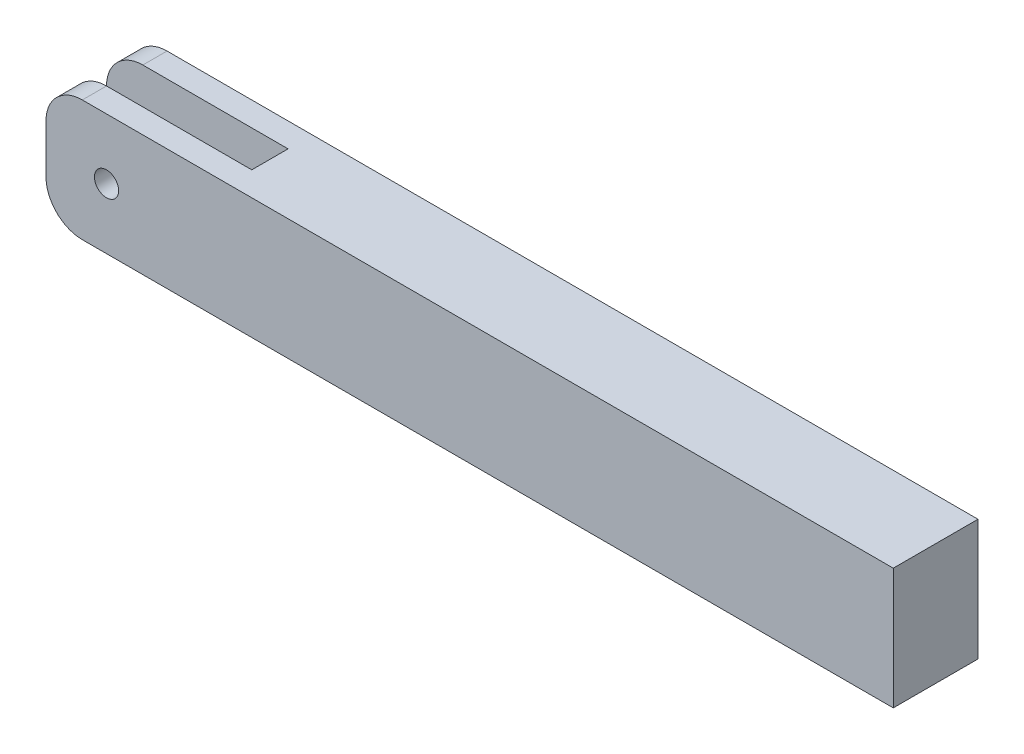
ISO-10303-21;
HEADER;
FILE_DESCRIPTION(('STEP AP214'),'2;1');
FILE_NAME('part.step','',(''),(''),'','','');
FILE_SCHEMA(('AUTOMOTIVE_DESIGN { 1 0 10303 214 1 1 1 1 }'));
ENDSEC;
DATA;
#1=APPLICATION_CONTEXT('core data for automotive mechanical design processes');
#2=APPLICATION_PROTOCOL_DEFINITION('international standard','automotive_design',2000,#1);
#3=PRODUCT_CONTEXT('',#1,'mechanical');
#4=PRODUCT('Part','Part','',(#3));
#5=PRODUCT_RELATED_PRODUCT_CATEGORY('part','',(#4));
#6=PRODUCT_DEFINITION_FORMATION('','',#4);
#7=PRODUCT_DEFINITION_CONTEXT('part definition',#1,'design');
#8=PRODUCT_DEFINITION('design','',#6,#7);
#9=PRODUCT_DEFINITION_SHAPE('','',#8);
#10=(LENGTH_UNIT() NAMED_UNIT(*) SI_UNIT(.MILLI.,.METRE.));
#11=(NAMED_UNIT(*) PLANE_ANGLE_UNIT() SI_UNIT($,.RADIAN.));
#12=(NAMED_UNIT(*) SI_UNIT($,.STERADIAN.) SOLID_ANGLE_UNIT());
#13=UNCERTAINTY_MEASURE_WITH_UNIT(LENGTH_MEASURE(1.E-05),#10,'distance_accuracy_value','');
#14=(GEOMETRIC_REPRESENTATION_CONTEXT(3) GLOBAL_UNCERTAINTY_ASSIGNED_CONTEXT((#13)) GLOBAL_UNIT_ASSIGNED_CONTEXT((#10,
#11,#12)) REPRESENTATION_CONTEXT('',''));
#15=CARTESIAN_POINT('',(0.,0.,0.));
#16=DIRECTION('',(0.,0.,1.));
#17=DIRECTION('',(1.,0.,0.));
#18=AXIS2_PLACEMENT_3D('',#15,#16,#17);
#19=CARTESIAN_POINT('',(-10.,10.,17.5));
#20=DIRECTION('',(0.,0.,-1.));
#21=DIRECTION('',(-1.,0.,0.));
#22=AXIS2_PLACEMENT_3D('',#19,#20,#21);
#23=CYLINDRICAL_SURFACE('',#22,15.);
#24=DIRECTION('',(0.,0.,-1.));
#25=VECTOR('',#24,1.);
#26=CARTESIAN_POINT('',(-25.,10.,17.5));
#27=LINE('',#26,#25);
#28=CARTESIAN_POINT('',(-25.,10.,-7.5));
#29=VERTEX_POINT('',#28);
#30=CARTESIAN_POINT('',(-25.,10.,-17.5));
#31=VERTEX_POINT('',#30);
#32=EDGE_CURVE('E217',#29,#31,#27,.T.);
#33=ORIENTED_EDGE('',*,*,#32,.F.);
#34=CARTESIAN_POINT('',(-10.,10.,-7.5));
#35=DIRECTION('',(0.,0.,-1.));
#36=DIRECTION('',(-1.,0.,0.));
#37=AXIS2_PLACEMENT_3D('',#34,#35,#36);
#38=CIRCLE('',#37,15.);
#39=CARTESIAN_POINT('',(-10.,25.,-7.5));
#40=VERTEX_POINT('',#39);
#41=EDGE_CURVE('E175',#29,#40,#38,.T.);
#42=ORIENTED_EDGE('',*,*,#41,.T.);
#43=DIRECTION('',(0.,0.,-1.));
#44=VECTOR('',#43,1.);
#45=CARTESIAN_POINT('',(-10.,25.,17.5));
#46=LINE('',#45,#44);
#47=CARTESIAN_POINT('',(-10.,25.,-17.5));
#48=VERTEX_POINT('',#47);
#49=EDGE_CURVE('E221',#40,#48,#46,.T.);
#50=ORIENTED_EDGE('',*,*,#49,.T.);
#51=CARTESIAN_POINT('',(-10.,10.,-17.5));
#52=DIRECTION('',(0.,0.,1.));
#53=DIRECTION('',(1.,0.,0.));
#54=AXIS2_PLACEMENT_3D('',#51,#52,#53);
#55=CIRCLE('',#54,15.);
#56=EDGE_CURVE('E184',#48,#31,#55,.T.);
#57=ORIENTED_EDGE('',*,*,#56,.T.);
#58=EDGE_LOOP('',(#33,#42,#50,#57));
#59=FACE_BOUND('',#58,.T.);
#60=ADVANCED_FACE('F43',(#59),#23,.T.);
#61=CARTESIAN_POINT('',(-25.,10.,17.5));
#62=DIRECTION('',(1.,0.,0.));
#63=DIRECTION('',(0.,1.,0.));
#64=AXIS2_PLACEMENT_3D('',#61,#62,#63);
#65=PLANE('',#64);
#66=DIRECTION('',(0.,0.,-1.));
#67=VECTOR('',#66,1.);
#68=CARTESIAN_POINT('',(-25.,-10.,17.5));
#69=LINE('',#68,#67);
#70=CARTESIAN_POINT('',(-25.,-10.,-7.5));
#71=VERTEX_POINT('',#70);
#72=CARTESIAN_POINT('',(-25.,-10.,-17.5));
#73=VERTEX_POINT('',#72);
#74=EDGE_CURVE('E213',#71,#73,#69,.T.);
#75=ORIENTED_EDGE('',*,*,#74,.F.);
#76=DIRECTION('',(0.,1.,0.));
#77=VECTOR('',#76,1.);
#78=CARTESIAN_POINT('',(-25.,-25.,-7.5));
#79=LINE('',#78,#77);
#80=EDGE_CURVE('E163',#71,#29,#79,.T.);
#81=ORIENTED_EDGE('',*,*,#80,.T.);
#82=ORIENTED_EDGE('',*,*,#32,.T.);
#83=DIRECTION('',(0.,-1.,0.));
#84=VECTOR('',#83,1.);
#85=CARTESIAN_POINT('',(-25.,10.,-17.5));
#86=LINE('',#85,#84);
#87=EDGE_CURVE('E187',#31,#73,#86,.T.);
#88=ORIENTED_EDGE('',*,*,#87,.T.);
#89=EDGE_LOOP('',(#75,#81,#82,#88));
#90=FACE_BOUND('',#89,.T.);
#91=ADVANCED_FACE('F241',(#90),#65,.F.);
#92=CARTESIAN_POINT('',(-10.,-10.,17.5));
#93=DIRECTION('',(0.,0.,-1.));
#94=DIRECTION('',(-1.,0.,0.));
#95=AXIS2_PLACEMENT_3D('',#92,#93,#94);
#96=CYLINDRICAL_SURFACE('',#95,15.);
#97=DIRECTION('',(0.,0.,-1.));
#98=VECTOR('',#97,1.);
#99=CARTESIAN_POINT('',(-10.,-25.,17.5));
#100=LINE('',#99,#98);
#101=CARTESIAN_POINT('',(-10.,-25.,-7.5));
#102=VERTEX_POINT('',#101);
#103=CARTESIAN_POINT('',(-10.,-25.,-17.5));
#104=VERTEX_POINT('',#103);
#105=EDGE_CURVE('E209',#102,#104,#100,.T.);
#106=ORIENTED_EDGE('',*,*,#105,.F.);
#107=CARTESIAN_POINT('',(-10.,-10.,-7.5));
#108=DIRECTION('',(0.,0.,-1.));
#109=DIRECTION('',(-1.,0.,0.));
#110=AXIS2_PLACEMENT_3D('',#107,#108,#109);
#111=CIRCLE('',#110,15.);
#112=EDGE_CURVE('E172',#102,#71,#111,.T.);
#113=ORIENTED_EDGE('',*,*,#112,.T.);
#114=ORIENTED_EDGE('',*,*,#74,.T.);
#115=CARTESIAN_POINT('',(-10.,-10.,-17.5));
#116=DIRECTION('',(0.,0.,1.));
#117=DIRECTION('',(-1.,0.,0.));
#118=AXIS2_PLACEMENT_3D('',#115,#116,#117);
#119=CIRCLE('',#118,15.);
#120=EDGE_CURVE('E190',#73,#104,#119,.T.);
#121=ORIENTED_EDGE('',*,*,#120,.T.);
#122=EDGE_LOOP('',(#106,#113,#114,#121));
#123=FACE_BOUND('',#122,.T.);
#124=ADVANCED_FACE('F244',(#123),#96,.T.);
#125=CARTESIAN_POINT('',(325.,25.,17.5));
#126=DIRECTION('',(-1.,0.,0.));
#127=DIRECTION('',(0.,0.,1.));
#128=AXIS2_PLACEMENT_3D('',#125,#126,#127);
#129=PLANE('',#128);
#130=DIRECTION('',(0.,1.,0.));
#131=VECTOR('',#130,1.);
#132=CARTESIAN_POINT('',(325.,25.,-17.5));
#133=LINE('',#132,#131);
#134=CARTESIAN_POINT('',(325.,-25.,-17.5));
#135=VERTEX_POINT('',#134);
#136=CARTESIAN_POINT('',(325.,25.,-17.5));
#137=VERTEX_POINT('',#136);
#138=EDGE_CURVE('E178',#135,#137,#133,.T.);
#139=ORIENTED_EDGE('',*,*,#138,.T.);
#140=DIRECTION('',(0.,0.,-1.));
#141=VECTOR('',#140,1.);
#142=CARTESIAN_POINT('',(325.,25.,17.5));
#143=LINE('',#142,#141);
#144=CARTESIAN_POINT('',(325.,25.,17.5));
#145=VERTEX_POINT('',#144);
#146=EDGE_CURVE('E52',#145,#137,#143,.T.);
#147=ORIENTED_EDGE('',*,*,#146,.F.);
#148=DIRECTION('',(0.,1.,0.));
#149=VECTOR('',#148,1.);
#150=CARTESIAN_POINT('',(325.,25.,17.5));
#151=LINE('',#150,#149);
#152=CARTESIAN_POINT('',(325.,-25.,17.5));
#153=VERTEX_POINT('',#152);
#154=EDGE_CURVE('E195',#153,#145,#151,.T.);
#155=ORIENTED_EDGE('',*,*,#154,.F.);
#156=DIRECTION('',(0.,0.,-1.));
#157=VECTOR('',#156,1.);
#158=CARTESIAN_POINT('',(325.,-25.,17.5));
#159=LINE('',#158,#157);
#160=EDGE_CURVE('E206',#153,#135,#159,.T.);
#161=ORIENTED_EDGE('',*,*,#160,.T.);
#162=EDGE_LOOP('',(#139,#147,#155,#161));
#163=FACE_BOUND('',#162,.T.);
#164=ADVANCED_FACE('F45',(#163),#129,.F.);
#165=CARTESIAN_POINT('',(-10.,25.,17.5));
#166=DIRECTION('',(0.,-1.,0.));
#167=DIRECTION('',(1.,0.,0.));
#168=AXIS2_PLACEMENT_3D('',#165,#166,#167);
#169=PLANE('',#168);
#170=ORIENTED_EDGE('',*,*,#49,.F.);
#171=DIRECTION('',(-1.,0.,0.));
#172=VECTOR('',#171,1.);
#173=CARTESIAN_POINT('',(-25.,25.,-7.5));
#174=LINE('',#173,#172);
#175=CARTESIAN_POINT('',(50.,25.,-7.49999999999999));
#176=VERTEX_POINT('',#175);
#177=EDGE_CURVE('E154',#176,#40,#174,.T.);
#178=ORIENTED_EDGE('',*,*,#177,.F.);
#179=DIRECTION('',(0.,0.,-1.));
#180=VECTOR('',#179,1.);
#181=CARTESIAN_POINT('',(50.,25.,-7.49999999999999));
#182=LINE('',#181,#180);
#183=CARTESIAN_POINT('',(50.,25.,7.49999999999999));
#184=VERTEX_POINT('',#183);
#185=EDGE_CURVE('E143',#184,#176,#182,.T.);
#186=ORIENTED_EDGE('',*,*,#185,.F.);
#187=DIRECTION('',(1.,0.,0.));
#188=VECTOR('',#187,1.);
#189=CARTESIAN_POINT('',(-25.,25.,7.5));
#190=LINE('',#189,#188);
#191=CARTESIAN_POINT('',(-10.,25.,7.5));
#192=VERTEX_POINT('',#191);
#193=EDGE_CURVE('E134',#192,#184,#190,.T.);
#194=ORIENTED_EDGE('',*,*,#193,.F.);
#195=CARTESIAN_POINT('',(-10.,25.,17.5));
#196=VERTEX_POINT('',#195);
#197=EDGE_CURVE('E222',#196,#192,#46,.T.);
#198=ORIENTED_EDGE('',*,*,#197,.F.);
#199=DIRECTION('',(-1.,0.,0.));
#200=VECTOR('',#199,1.);
#201=CARTESIAN_POINT('',(-10.,25.,17.5));
#202=LINE('',#201,#200);
#203=EDGE_CURVE('E197',#145,#196,#202,.T.);
#204=ORIENTED_EDGE('',*,*,#203,.F.);
#205=ORIENTED_EDGE('',*,*,#146,.T.);
#206=DIRECTION('',(-1.,0.,0.));
#207=VECTOR('',#206,1.);
#208=CARTESIAN_POINT('',(-10.,25.,-17.5));
#209=LINE('',#208,#207);
#210=EDGE_CURVE('E181',#137,#48,#209,.T.);
#211=ORIENTED_EDGE('',*,*,#210,.T.);
#212=EDGE_LOOP('',(#170,#178,#186,#194,#198,#204,#205,#211));
#213=FACE_BOUND('',#212,.T.);
#214=ADVANCED_FACE('F153',(#213),#169,.F.);
#215=ORIENTED_EDGE('',*,*,#197,.T.);
#216=CARTESIAN_POINT('',(-10.,10.,7.5));
#217=DIRECTION('',(0.,0.,1.));
#218=DIRECTION('',(1.,0.,0.));
#219=AXIS2_PLACEMENT_3D('',#216,#217,#218);
#220=CIRCLE('',#219,15.);
#221=CARTESIAN_POINT('',(-25.,10.,7.5));
#222=VERTEX_POINT('',#221);
#223=EDGE_CURVE('E138',#192,#222,#220,.T.);
#224=ORIENTED_EDGE('',*,*,#223,.T.);
#225=CARTESIAN_POINT('',(-25.,10.,17.5));
#226=VERTEX_POINT('',#225);
#227=EDGE_CURVE('E218',#226,#222,#27,.T.);
#228=ORIENTED_EDGE('',*,*,#227,.F.);
#229=CARTESIAN_POINT('',(-10.,10.,17.5));
#230=DIRECTION('',(0.,0.,1.));
#231=DIRECTION('',(1.,0.,0.));
#232=AXIS2_PLACEMENT_3D('',#229,#230,#231);
#233=CIRCLE('',#232,15.);
#234=EDGE_CURVE('E199',#196,#226,#233,.T.);
#235=ORIENTED_EDGE('',*,*,#234,.F.);
#236=EDGE_LOOP('',(#215,#224,#228,#235));
#237=FACE_BOUND('',#236,.T.);
#238=ADVANCED_FACE('F259',(#237),#23,.T.);
#239=ORIENTED_EDGE('',*,*,#227,.T.);
#240=DIRECTION('',(0.,1.,0.));
#241=VECTOR('',#240,1.);
#242=CARTESIAN_POINT('',(-25.,-25.,7.5));
#243=LINE('',#242,#241);
#244=CARTESIAN_POINT('',(-25.,-10.,7.5));
#245=VERTEX_POINT('',#244);
#246=EDGE_CURVE('E150',#245,#222,#243,.T.);
#247=ORIENTED_EDGE('',*,*,#246,.F.);
#248=CARTESIAN_POINT('',(-25.,-10.,17.5));
#249=VERTEX_POINT('',#248);
#250=EDGE_CURVE('E214',#249,#245,#69,.T.);
#251=ORIENTED_EDGE('',*,*,#250,.F.);
#252=DIRECTION('',(0.,-1.,0.));
#253=VECTOR('',#252,1.);
#254=CARTESIAN_POINT('',(-25.,10.,17.5));
#255=LINE('',#254,#253);
#256=EDGE_CURVE('E201',#226,#249,#255,.T.);
#257=ORIENTED_EDGE('',*,*,#256,.F.);
#258=EDGE_LOOP('',(#239,#247,#251,#257));
#259=FACE_BOUND('',#258,.T.);
#260=ADVANCED_FACE('F256',(#259),#65,.F.);
#261=ORIENTED_EDGE('',*,*,#250,.T.);
#262=CARTESIAN_POINT('',(-10.,-10.,7.5));
#263=DIRECTION('',(0.,0.,1.));
#264=DIRECTION('',(1.,0.,0.));
#265=AXIS2_PLACEMENT_3D('',#262,#263,#264);
#266=CIRCLE('',#265,15.);
#267=CARTESIAN_POINT('',(-10.,-25.,7.5));
#268=VERTEX_POINT('',#267);
#269=EDGE_CURVE('E166',#245,#268,#266,.T.);
#270=ORIENTED_EDGE('',*,*,#269,.T.);
#271=CARTESIAN_POINT('',(-10.,-25.,17.5));
#272=VERTEX_POINT('',#271);
#273=EDGE_CURVE('E210',#272,#268,#100,.T.);
#274=ORIENTED_EDGE('',*,*,#273,.F.);
#275=CARTESIAN_POINT('',(-10.,-10.,17.5));
#276=DIRECTION('',(0.,0.,1.));
#277=DIRECTION('',(-1.,0.,0.));
#278=AXIS2_PLACEMENT_3D('',#275,#276,#277);
#279=CIRCLE('',#278,15.);
#280=EDGE_CURVE('E203',#249,#272,#279,.T.);
#281=ORIENTED_EDGE('',*,*,#280,.F.);
#282=EDGE_LOOP('',(#261,#270,#274,#281));
#283=FACE_BOUND('',#282,.T.);
#284=ADVANCED_FACE('F251',(#283),#96,.T.);
#285=CARTESIAN_POINT('',(-10.,-25.,17.5));
#286=DIRECTION('',(0.,1.,0.));
#287=DIRECTION('',(-1.,0.,0.));
#288=AXIS2_PLACEMENT_3D('',#285,#286,#287);
#289=PLANE('',#288);
#290=DIRECTION('',(0.,0.,-1.));
#291=VECTOR('',#290,1.);
#292=CARTESIAN_POINT('',(50.,-25.,-7.49999999999999));
#293=LINE('',#292,#291);
#294=CARTESIAN_POINT('',(50.,-25.,7.49999999999999));
#295=VERTEX_POINT('',#294);
#296=CARTESIAN_POINT('',(50.,-25.,-7.49999999999999));
#297=VERTEX_POINT('',#296);
#298=EDGE_CURVE('E59',#295,#297,#293,.T.);
#299=ORIENTED_EDGE('',*,*,#298,.T.);
#300=DIRECTION('',(-1.,0.,0.));
#301=VECTOR('',#300,1.);
#302=CARTESIAN_POINT('',(-25.,-25.,-7.5));
#303=LINE('',#302,#301);
#304=EDGE_CURVE('E160',#297,#102,#303,.T.);
#305=ORIENTED_EDGE('',*,*,#304,.T.);
#306=ORIENTED_EDGE('',*,*,#105,.T.);
#307=DIRECTION('',(1.,0.,0.));
#308=VECTOR('',#307,1.);
#309=CARTESIAN_POINT('',(-10.,-25.,-17.5));
#310=LINE('',#309,#308);
#311=EDGE_CURVE('E193',#104,#135,#310,.T.);
#312=ORIENTED_EDGE('',*,*,#311,.T.);
#313=ORIENTED_EDGE('',*,*,#160,.F.);
#314=DIRECTION('',(1.,0.,0.));
#315=VECTOR('',#314,1.);
#316=CARTESIAN_POINT('',(-10.,-25.,17.5));
#317=LINE('',#316,#315);
#318=EDGE_CURVE('E67',#272,#153,#317,.T.);
#319=ORIENTED_EDGE('',*,*,#318,.F.);
#320=ORIENTED_EDGE('',*,*,#273,.T.);
#321=DIRECTION('',(1.,0.,0.));
#322=VECTOR('',#321,1.);
#323=CARTESIAN_POINT('',(-10.,-25.,7.5));
#324=LINE('',#323,#322);
#325=EDGE_CURVE('E12',#268,#295,#324,.T.);
#326=ORIENTED_EDGE('',*,*,#325,.T.);
#327=EDGE_LOOP('',(#299,#305,#306,#312,#313,#319,#320,#326));
#328=FACE_BOUND('',#327,.T.);
#329=ADVANCED_FACE('F247',(#328),#289,.F.);
#330=CARTESIAN_POINT('',(-10.,-10.,17.5));
#331=DIRECTION('',(0.,0.,-1.));
#332=DIRECTION('',(-1.,0.,0.));
#333=AXIS2_PLACEMENT_3D('',#330,#331,#332);
#334=PLANE('',#333);
#335=CARTESIAN_POINT('',(0.,0.,17.5));
#336=DIRECTION('',(0.,0.,1.));
#337=DIRECTION('',(1.,0.,0.));
#338=AXIS2_PLACEMENT_3D('',#335,#336,#337);
#339=CIRCLE('',#338,5.);
#340=CARTESIAN_POINT('',(5.,0.,17.5));
#341=VERTEX_POINT('',#340);
#342=EDGE_CURVE('E372',#341,#341,#339,.T.);
#343=ORIENTED_EDGE('',*,*,#342,.F.);
#344=EDGE_LOOP('',(#343));
#345=FACE_BOUND('',#344,.T.);
#346=ORIENTED_EDGE('',*,*,#154,.T.);
#347=ORIENTED_EDGE('',*,*,#203,.T.);
#348=ORIENTED_EDGE('',*,*,#234,.T.);
#349=ORIENTED_EDGE('',*,*,#256,.T.);
#350=ORIENTED_EDGE('',*,*,#280,.T.);
#351=ORIENTED_EDGE('',*,*,#318,.T.);
#352=EDGE_LOOP('',(#346,#347,#348,#349,#350,#351));
#353=FACE_BOUND('',#352,.T.);
#354=ADVANCED_FACE('F261',(#345,#353),#334,.F.);
#355=CARTESIAN_POINT('',(-10.,-10.,-17.5));
#356=DIRECTION('',(0.,0.,-1.));
#357=DIRECTION('',(-1.,0.,0.));
#358=AXIS2_PLACEMENT_3D('',#355,#356,#357);
#359=PLANE('',#358);
#360=CARTESIAN_POINT('',(0.,0.,-17.5));
#361=DIRECTION('',(0.,0.,1.));
#362=DIRECTION('',(1.,0.,0.));
#363=AXIS2_PLACEMENT_3D('',#360,#361,#362);
#364=CIRCLE('',#363,5.);
#365=CARTESIAN_POINT('',(5.,0.,-17.5));
#366=VERTEX_POINT('',#365);
#367=EDGE_CURVE('E366',#366,#366,#364,.T.);
#368=ORIENTED_EDGE('',*,*,#367,.T.);
#369=EDGE_LOOP('',(#368));
#370=FACE_BOUND('',#369,.T.);
#371=ORIENTED_EDGE('',*,*,#138,.F.);
#372=ORIENTED_EDGE('',*,*,#311,.F.);
#373=ORIENTED_EDGE('',*,*,#120,.F.);
#374=ORIENTED_EDGE('',*,*,#87,.F.);
#375=ORIENTED_EDGE('',*,*,#56,.F.);
#376=ORIENTED_EDGE('',*,*,#210,.F.);
#377=EDGE_LOOP('',(#371,#372,#373,#374,#375,#376));
#378=FACE_BOUND('',#377,.T.);
#379=ADVANCED_FACE('F232',(#370,#378),#359,.T.);
#380=CARTESIAN_POINT('',(-25.,-25.,-7.5));
#381=DIRECTION('',(0.,0.,-1.));
#382=DIRECTION('',(-1.,0.,0.));
#383=AXIS2_PLACEMENT_3D('',#380,#381,#382);
#384=PLANE('',#383);
#385=CARTESIAN_POINT('',(0.,0.,-7.5));
#386=DIRECTION('',(0.,0.,-1.));
#387=DIRECTION('',(-1.,0.,0.));
#388=AXIS2_PLACEMENT_3D('',#385,#386,#387);
#389=CIRCLE('',#388,5.);
#390=CARTESIAN_POINT('',(-5.,0.,-7.5));
#391=VERTEX_POINT('',#390);
#392=EDGE_CURVE('E144',#391,#391,#389,.T.);
#393=ORIENTED_EDGE('',*,*,#392,.T.);
#394=EDGE_LOOP('',(#393));
#395=FACE_BOUND('',#394,.T.);
#396=ORIENTED_EDGE('',*,*,#80,.F.);
#397=ORIENTED_EDGE('',*,*,#112,.F.);
#398=ORIENTED_EDGE('',*,*,#304,.F.);
#399=DIRECTION('',(0.,1.,0.));
#400=VECTOR('',#399,1.);
#401=CARTESIAN_POINT('',(50.,-25.,-7.49999999999999));
#402=LINE('',#401,#400);
#403=EDGE_CURVE('E149',#297,#176,#402,.T.);
#404=ORIENTED_EDGE('',*,*,#403,.T.);
#405=ORIENTED_EDGE('',*,*,#177,.T.);
#406=ORIENTED_EDGE('',*,*,#41,.F.);
#407=EDGE_LOOP('',(#396,#397,#398,#404,#405,#406));
#408=FACE_BOUND('',#407,.T.);
#409=ADVANCED_FACE('F238',(#395,#408),#384,.F.);
#410=CARTESIAN_POINT('',(-25.,-25.,7.5));
#411=DIRECTION('',(0.,0.,1.));
#412=DIRECTION('',(1.,0.,0.));
#413=AXIS2_PLACEMENT_3D('',#410,#411,#412);
#414=PLANE('',#413);
#415=CARTESIAN_POINT('',(0.,0.,7.5));
#416=DIRECTION('',(0.,0.,1.));
#417=DIRECTION('',(1.,0.,0.));
#418=AXIS2_PLACEMENT_3D('',#415,#416,#417);
#419=CIRCLE('',#418,5.);
#420=CARTESIAN_POINT('',(5.,0.,7.5));
#421=VERTEX_POINT('',#420);
#422=EDGE_CURVE('E47',#421,#421,#419,.T.);
#423=ORIENTED_EDGE('',*,*,#422,.T.);
#424=EDGE_LOOP('',(#423));
#425=FACE_BOUND('',#424,.T.);
#426=ORIENTED_EDGE('',*,*,#193,.T.);
#427=DIRECTION('',(0.,1.,0.));
#428=VECTOR('',#427,1.);
#429=CARTESIAN_POINT('',(50.,-25.,7.49999999999999));
#430=LINE('',#429,#428);
#431=EDGE_CURVE('E136',#295,#184,#430,.T.);
#432=ORIENTED_EDGE('',*,*,#431,.F.);
#433=ORIENTED_EDGE('',*,*,#325,.F.);
#434=ORIENTED_EDGE('',*,*,#269,.F.);
#435=ORIENTED_EDGE('',*,*,#246,.T.);
#436=ORIENTED_EDGE('',*,*,#223,.F.);
#437=EDGE_LOOP('',(#426,#432,#433,#434,#435,#436));
#438=FACE_BOUND('',#437,.T.);
#439=ADVANCED_FACE('F135',(#425,#438),#414,.F.);
#440=CARTESIAN_POINT('',(50.,-25.,-7.49999999999999));
#441=DIRECTION('',(1.,0.,0.));
#442=DIRECTION('',(0.,0.,-1.));
#443=AXIS2_PLACEMENT_3D('',#440,#441,#442);
#444=PLANE('',#443);
#445=ORIENTED_EDGE('',*,*,#185,.T.);
#446=ORIENTED_EDGE('',*,*,#403,.F.);
#447=ORIENTED_EDGE('',*,*,#298,.F.);
#448=ORIENTED_EDGE('',*,*,#431,.T.);
#449=EDGE_LOOP('',(#445,#446,#447,#448));
#450=FACE_BOUND('',#449,.T.);
#451=ADVANCED_FACE('F147',(#450),#444,.F.);
#452=CARTESIAN_POINT('',(0.,0.,-17.5));
#453=DIRECTION('',(0.,0.,1.));
#454=DIRECTION('',(1.,0.,0.));
#455=AXIS2_PLACEMENT_3D('',#452,#453,#454);
#456=CYLINDRICAL_SURFACE('',#455,5.);
#457=ORIENTED_EDGE('',*,*,#342,.T.);
#458=EDGE_LOOP('',(#457));
#459=FACE_BOUND('',#458,.T.);
#460=ORIENTED_EDGE('',*,*,#422,.F.);
#461=EDGE_LOOP('',(#460));
#462=FACE_BOUND('',#461,.T.);
#463=ADVANCED_FACE('F311',(#459,#462),#456,.F.);
#464=ORIENTED_EDGE('',*,*,#367,.F.);
#465=EDGE_LOOP('',(#464));
#466=FACE_BOUND('',#465,.T.);
#467=ORIENTED_EDGE('',*,*,#392,.F.);
#468=EDGE_LOOP('',(#467));
#469=FACE_BOUND('',#468,.T.);
#470=ADVANCED_FACE('F350',(#466,#469),#456,.F.);
#471=CLOSED_SHELL('',(#60,#91,#124,#164,#214,#238,#260,#284,#329,#354,#379,#409,#439,#451,#463,#470));
#472=MANIFOLD_SOLID_BREP('B2',#471);
#473=ADVANCED_BREP_SHAPE_REPRESENTATION('',(#18,#472),#14);
#474=SHAPE_DEFINITION_REPRESENTATION(#9,#473);
ENDSEC;
END-ISO-10303-21;
